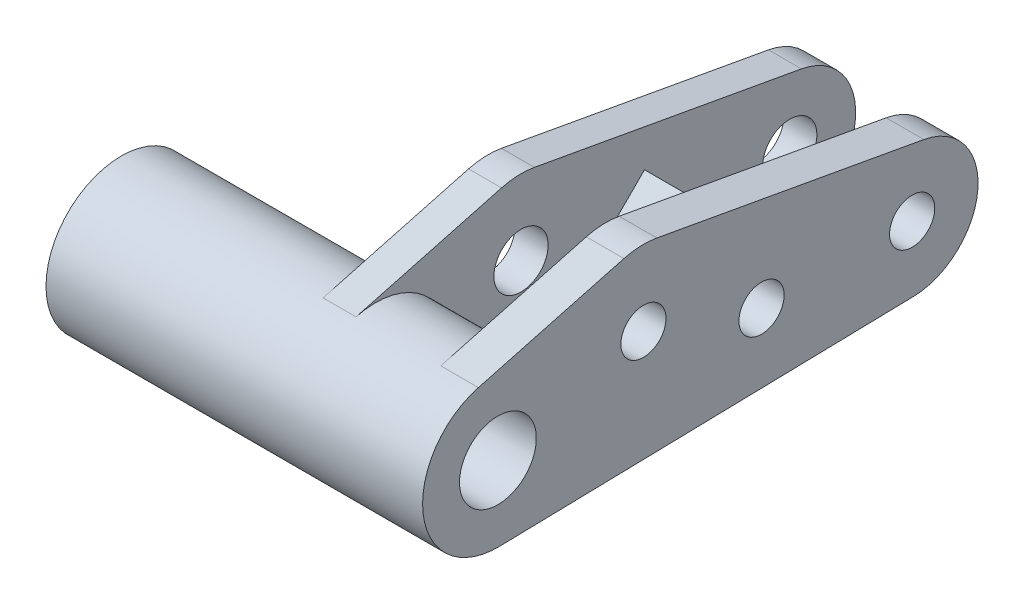
ISO-10303-21;
HEADER;
FILE_DESCRIPTION(('STEP AP214'),'2;1');
FILE_NAME('part.step','',(''),(''),'','','');
FILE_SCHEMA(('AUTOMOTIVE_DESIGN { 1 0 10303 214 1 1 1 1 }'));
ENDSEC;
DATA;
#1=APPLICATION_CONTEXT('core data for automotive mechanical design processes');
#2=APPLICATION_PROTOCOL_DEFINITION('international standard','automotive_design',2000,#1);
#3=PRODUCT_CONTEXT('',#1,'mechanical');
#4=PRODUCT('Part','Part','',(#3));
#5=PRODUCT_RELATED_PRODUCT_CATEGORY('part','',(#4));
#6=PRODUCT_DEFINITION_FORMATION('','',#4);
#7=PRODUCT_DEFINITION_CONTEXT('part definition',#1,'design');
#8=PRODUCT_DEFINITION('design','',#6,#7);
#9=PRODUCT_DEFINITION_SHAPE('','',#8);
#10=(LENGTH_UNIT() NAMED_UNIT(*) SI_UNIT(.MILLI.,.METRE.));
#11=(NAMED_UNIT(*) PLANE_ANGLE_UNIT() SI_UNIT($,.RADIAN.));
#12=(NAMED_UNIT(*) SI_UNIT($,.STERADIAN.) SOLID_ANGLE_UNIT());
#13=UNCERTAINTY_MEASURE_WITH_UNIT(LENGTH_MEASURE(1.E-05),#10,'distance_accuracy_value','');
#14=(GEOMETRIC_REPRESENTATION_CONTEXT(3) GLOBAL_UNCERTAINTY_ASSIGNED_CONTEXT((#13)) GLOBAL_UNIT_ASSIGNED_CONTEXT((#10,
#11,#12)) REPRESENTATION_CONTEXT('',''));
#15=CARTESIAN_POINT('',(0.,0.,0.));
#16=DIRECTION('',(0.,0.,1.));
#17=DIRECTION('',(1.,0.,0.));
#18=AXIS2_PLACEMENT_3D('',#15,#16,#17);
#19=CARTESIAN_POINT('',(-13.096875,-6.34835980883225,-0.144318181818181));
#20=DIRECTION('',(0.,-0.999741702178308,-0.0227272727272727));
#21=DIRECTION('',(0.,-0.0227272727272727,0.999741702178308));
#22=AXIS2_PLACEMENT_3D('',#19,#20,#21);
#23=PLANE('',#22);
#24=DIRECTION('',(1.,0.,0.));
#25=VECTOR('',#24,1.);
#26=CARTESIAN_POINT('',(-10.31875,-5.62468257207032,-31.9778919321734));
#27=LINE('',#26,#25);
#28=CARTESIAN_POINT('',(-10.31875,-5.62468257207032,-31.9778919321734));
#29=VERTEX_POINT('',#28);
#30=CARTESIAN_POINT('',(-3.175,-5.62468257207032,-31.9778919321734));
#31=VERTEX_POINT('',#30);
#32=EDGE_CURVE('E220',#29,#31,#27,.T.);
#33=ORIENTED_EDGE('',*,*,#32,.T.);
#34=DIRECTION('',(0.,-0.022727272727273,0.999741702178308));
#35=VECTOR('',#34,1.);
#36=CARTESIAN_POINT('',(-3.175,-5.55481483272822,-35.0512784090909));
#37=LINE('',#36,#35);
#38=CARTESIAN_POINT('',(-3.175,-5.55481483272822,-35.0512784090909));
#39=VERTEX_POINT('',#38);
#40=EDGE_CURVE('E194',#39,#31,#37,.T.);
#41=ORIENTED_EDGE('',*,*,#40,.F.);
#42=DIRECTION('',(1.,0.,0.));
#43=VECTOR('',#42,1.);
#44=CARTESIAN_POINT('',(-13.096875,-5.55481483272822,-35.0512784090909));
#45=LINE('',#44,#43);
#46=CARTESIAN_POINT('',(0.,-5.55481483272822,-35.0512784090909));
#47=VERTEX_POINT('',#46);
#48=EDGE_CURVE('E130',#39,#47,#45,.T.);
#49=ORIENTED_EDGE('',*,*,#48,.T.);
#50=DIRECTION('',(0.,-0.0227272727272727,0.999741702178308));
#51=VECTOR('',#50,1.);
#52=CARTESIAN_POINT('',(0.,-6.34835980883225,-0.144318181818181));
#53=LINE('',#52,#51);
#54=CARTESIAN_POINT('',(0.,-6.34835980883225,-0.144318181818181));
#55=VERTEX_POINT('',#54);
#56=EDGE_CURVE('E153',#47,#55,#53,.T.);
#57=ORIENTED_EDGE('',*,*,#56,.T.);
#58=DIRECTION('',(1.,0.,0.));
#59=VECTOR('',#58,1.);
#60=CARTESIAN_POINT('',(-13.096875,-6.34835980883225,-0.144318181818181));
#61=LINE('',#60,#59);
#62=CARTESIAN_POINT('',(-13.096875,-6.34835980883225,-0.144318181818181));
#63=VERTEX_POINT('',#62);
#64=EDGE_CURVE('E50',#63,#55,#61,.T.);
#65=ORIENTED_EDGE('',*,*,#64,.F.);
#66=DIRECTION('',(0.,-0.0227272727272727,0.999741702178308));
#67=VECTOR('',#66,1.);
#68=CARTESIAN_POINT('',(-13.096875,-6.34835980883225,-0.144318181818181));
#69=LINE('',#68,#67);
#70=CARTESIAN_POINT('',(-13.096875,-5.55481483272822,-35.0512784090909));
#71=VERTEX_POINT('',#70);
#72=EDGE_CURVE('E137',#71,#63,#69,.T.);
#73=ORIENTED_EDGE('',*,*,#72,.F.);
#74=CARTESIAN_POINT('',(-10.31875,-5.55481483272822,-35.0512784090909));
#75=VERTEX_POINT('',#74);
#76=EDGE_CURVE('E135',#71,#75,#45,.T.);
#77=ORIENTED_EDGE('',*,*,#76,.T.);
#78=DIRECTION('',(0.,-0.022727272727273,0.999741702178308));
#79=VECTOR('',#78,1.);
#80=CARTESIAN_POINT('',(-10.31875,-5.55481483272822,-35.0512784090909));
#81=LINE('',#80,#79);
#82=EDGE_CURVE('E246',#75,#29,#81,.T.);
#83=ORIENTED_EDGE('',*,*,#82,.T.);
#84=EDGE_LOOP('',(#33,#41,#49,#57,#65,#73,#77,#83));
#85=FACE_BOUND('',#84,.T.);
#86=ADVANCED_FACE('F41',(#85),#23,.T.);
#87=CARTESIAN_POINT('',(-13.096875,0.,-34.925));
#88=DIRECTION('',(1.,0.,0.));
#89=DIRECTION('',(0.,0.,1.));
#90=AXIS2_PLACEMENT_3D('',#87,#88,#89);
#91=CYLINDRICAL_SURFACE('',#90,5.55625);
#92=ORIENTED_EDGE('',*,*,#76,.F.);
#93=CARTESIAN_POINT('',(-13.096875,0.,-34.925));
#94=DIRECTION('',(-1.,0.,0.));
#95=DIRECTION('',(0.,0.,-1.));
#96=AXIS2_PLACEMENT_3D('',#93,#94,#95);
#97=CIRCLE('',#96,5.55625);
#98=CARTESIAN_POINT('',(-13.096875,5.46772752838044,-35.9128611936354));
#99=VERTEX_POINT('',#98);
#100=EDGE_CURVE('E112',#99,#71,#97,.T.);
#101=ORIENTED_EDGE('',*,*,#100,.F.);
#102=DIRECTION('',(1.,0.,0.));
#103=VECTOR('',#102,1.);
#104=CARTESIAN_POINT('',(-13.096875,5.46772752838044,-35.9128611936354));
#105=LINE('',#104,#103);
#106=CARTESIAN_POINT('',(-10.31875,5.46772752838044,-35.9128611936354));
#107=VERTEX_POINT('',#106);
#108=EDGE_CURVE('E122',#99,#107,#105,.T.);
#109=ORIENTED_EDGE('',*,*,#108,.T.);
#110=CARTESIAN_POINT('',(-10.31875,0.,-34.925));
#111=DIRECTION('',(-1.,0.,0.));
#112=DIRECTION('',(0.,0.,1.));
#113=AXIS2_PLACEMENT_3D('',#110,#111,#112);
#114=CIRCLE('',#113,5.55625);
#115=EDGE_CURVE('E248',#107,#75,#114,.T.);
#116=ORIENTED_EDGE('',*,*,#115,.T.);
#117=EDGE_LOOP('',(#92,#101,#109,#116));
#118=FACE_BOUND('',#117,.T.);
#119=ADVANCED_FACE('F133',(#118),#91,.T.);
#120=CARTESIAN_POINT('',(-13.096875,5.46772752838044,-35.9128611936354));
#121=DIRECTION('',(0.,0.984067946615152,-0.177792790755526));
#122=DIRECTION('',(0.,-0.177792790755526,-0.984067946615152));
#123=AXIS2_PLACEMENT_3D('',#120,#121,#122);
#124=PLANE('',#123);
#125=ORIENTED_EDGE('',*,*,#108,.F.);
#126=DIRECTION('',(0.,-0.177792790755526,-0.984067946615152));
#127=VECTOR('',#126,1.);
#128=CARTESIAN_POINT('',(-13.096875,5.46772752838044,-35.9128611936354));
#129=LINE('',#128,#127);
#130=CARTESIAN_POINT('',(-13.096875,9.53583333380815,-13.3962422151688));
#131=VERTEX_POINT('',#130);
#132=EDGE_CURVE('E108',#131,#99,#129,.T.);
#133=ORIENTED_EDGE('',*,*,#132,.F.);
#134=DIRECTION('',(1.,0.,0.));
#135=VECTOR('',#134,1.);
#136=CARTESIAN_POINT('',(-13.096875,9.53583333380815,-13.3962422151688));
#137=LINE('',#136,#135);
#138=CARTESIAN_POINT('',(-10.31875,9.53583333380815,-13.3962422151688));
#139=VERTEX_POINT('',#138);
#140=EDGE_CURVE('E158',#131,#139,#137,.T.);
#141=ORIENTED_EDGE('',*,*,#140,.T.);
#142=DIRECTION('',(0.,-0.177792790755526,-0.984067946615152));
#143=VECTOR('',#142,1.);
#144=CARTESIAN_POINT('',(-10.31875,9.53583333380815,-13.3962422151688));
#145=LINE('',#144,#143);
#146=EDGE_CURVE('E126',#139,#107,#145,.T.);
#147=ORIENTED_EDGE('',*,*,#146,.T.);
#148=EDGE_LOOP('',(#125,#133,#141,#147));
#149=FACE_BOUND('',#148,.T.);
#150=ADVANCED_FACE('F123',(#149),#124,.T.);
#151=CARTESIAN_POINT('',(-13.096875,3.28700187280193,-12.2672579938712));
#152=DIRECTION('',(1.,0.,0.));
#153=DIRECTION('',(0.,0.,1.));
#154=AXIS2_PLACEMENT_3D('',#151,#152,#153);
#155=CYLINDRICAL_SURFACE('',#154,6.35);
#156=ORIENTED_EDGE('',*,*,#140,.F.);
#157=CARTESIAN_POINT('',(-13.096875,3.28700187280193,-12.2672579938712));
#158=DIRECTION('',(-1.,0.,0.));
#159=DIRECTION('',(0.,0.,-1.));
#160=AXIS2_PLACEMENT_3D('',#157,#158,#159);
#161=CIRCLE('',#160,6.35);
#162=CARTESIAN_POINT('',(-13.096875,9.42063086973753,-10.6237570574702));
#163=VERTEX_POINT('',#162);
#164=EDGE_CURVE('E115',#163,#131,#161,.T.);
#165=ORIENTED_EDGE('',*,*,#164,.F.);
#166=DIRECTION('',(1.,0.,0.));
#167=VECTOR('',#166,1.);
#168=CARTESIAN_POINT('',(-13.096875,9.42063086973753,-10.6237570574702));
#169=LINE('',#168,#167);
#170=CARTESIAN_POINT('',(-10.31875,9.42063086973753,-10.6237570574702));
#171=VERTEX_POINT('',#170);
#172=EDGE_CURVE('E161',#163,#171,#169,.T.);
#173=ORIENTED_EDGE('',*,*,#172,.T.);
#174=CARTESIAN_POINT('',(-10.31875,3.28700187280193,-12.2672579938712));
#175=DIRECTION('',(-1.,0.,0.));
#176=DIRECTION('',(0.,0.,1.));
#177=AXIS2_PLACEMENT_3D('',#174,#175,#176);
#178=CIRCLE('',#177,6.35);
#179=EDGE_CURVE('E251',#171,#139,#178,.T.);
#180=ORIENTED_EDGE('',*,*,#179,.T.);
#181=EDGE_LOOP('',(#156,#165,#173,#180));
#182=FACE_BOUND('',#181,.T.);
#183=ADVANCED_FACE('F357',(#182),#155,.T.);
#184=CARTESIAN_POINT('',(-13.096875,9.42063086973753,-10.6237570574702));
#185=DIRECTION('',(0.,0.96592582628907,0.258819045102514));
#186=DIRECTION('',(0.,0.258819045102514,-0.96592582628907));
#187=AXIS2_PLACEMENT_3D('',#184,#185,#186);
#188=PLANE('',#187);
#189=ORIENTED_EDGE('',*,*,#172,.F.);
#190=DIRECTION('',(0.,0.258819045102514,-0.96592582628907));
#191=VECTOR('',#190,1.);
#192=CARTESIAN_POINT('',(-13.096875,9.42063086973753,-10.6237570574702));
#193=LINE('',#192,#191);
#194=CARTESIAN_POINT('',(-13.096875,6.13362899693559,1.64350093640097));
#195=VERTEX_POINT('',#194);
#196=EDGE_CURVE('E100',#195,#163,#193,.T.);
#197=ORIENTED_EDGE('',*,*,#196,.F.);
#198=DIRECTION('',(1.,0.,0.));
#199=VECTOR('',#198,1.);
#200=CARTESIAN_POINT('',(-13.096875,6.1336289969356,1.64350093640097));
#201=LINE('',#200,#199);
#202=CARTESIAN_POINT('',(-10.31875,6.1336289969356,1.64350093640097));
#203=VERTEX_POINT('',#202);
#204=EDGE_CURVE('E165',#195,#203,#201,.T.);
#205=ORIENTED_EDGE('',*,*,#204,.T.);
#206=DIRECTION('',(0.,0.258819045102514,-0.96592582628907));
#207=VECTOR('',#206,1.);
#208=CARTESIAN_POINT('',(-10.31875,6.1336289969356,1.64350093640097));
#209=LINE('',#208,#207);
#210=EDGE_CURVE('E254',#203,#171,#209,.T.);
#211=ORIENTED_EDGE('',*,*,#210,.T.);
#212=EDGE_LOOP('',(#189,#197,#205,#211));
#213=FACE_BOUND('',#212,.T.);
#214=ADVANCED_FACE('F355',(#213),#188,.T.);
#215=CARTESIAN_POINT('',(-13.096875,0.,0.));
#216=DIRECTION('',(1.,0.,0.));
#217=DIRECTION('',(0.,0.,1.));
#218=AXIS2_PLACEMENT_3D('',#215,#216,#217);
#219=CYLINDRICAL_SURFACE('',#218,6.35);
#220=CARTESIAN_POINT('',(0.,0.,0.));
#221=DIRECTION('',(-1.,0.,0.));
#222=DIRECTION('',(0.,0.,1.));
#223=AXIS2_PLACEMENT_3D('',#220,#221,#222);
#224=CIRCLE('',#223,6.35);
#225=CARTESIAN_POINT('',(0.,6.1336289969356,1.64350093640097));
#226=VERTEX_POINT('',#225);
#227=EDGE_CURVE('E93',#55,#226,#224,.T.);
#228=ORIENTED_EDGE('',*,*,#227,.T.);
#229=CARTESIAN_POINT('',(-3.175,6.1336289969356,1.64350093640097));
#230=VERTEX_POINT('',#229);
#231=EDGE_CURVE('E139',#230,#226,#201,.T.);
#232=ORIENTED_EDGE('',*,*,#231,.F.);
#233=CARTESIAN_POINT('',(-3.175,0.,0.));
#234=DIRECTION('',(1.,0.,0.));
#235=DIRECTION('',(0.,0.,1.));
#236=AXIS2_PLACEMENT_3D('',#233,#234,#235);
#237=CIRCLE('',#236,6.35);
#238=CARTESIAN_POINT('',(-3.175,1.64350093640097,-6.13362899693559));
#239=VERTEX_POINT('',#238);
#240=EDGE_CURVE('E173',#239,#230,#237,.T.);
#241=ORIENTED_EDGE('',*,*,#240,.F.);
#242=DIRECTION('',(1.,0.,0.));
#243=VECTOR('',#242,1.);
#244=CARTESIAN_POINT('',(-10.31875,1.64350093640097,-6.13362899693559));
#245=LINE('',#244,#243);
#246=CARTESIAN_POINT('',(-10.31875,1.64350093640097,-6.13362899693559));
#247=VERTEX_POINT('',#246);
#248=EDGE_CURVE('E145',#247,#239,#245,.T.);
#249=ORIENTED_EDGE('',*,*,#248,.F.);
#250=CARTESIAN_POINT('',(-10.31875,0.,0.));
#251=DIRECTION('',(1.,0.,0.));
#252=DIRECTION('',(0.,0.,1.));
#253=AXIS2_PLACEMENT_3D('',#250,#251,#252);
#254=CIRCLE('',#253,6.35);
#255=EDGE_CURVE('E208',#247,#203,#254,.T.);
#256=ORIENTED_EDGE('',*,*,#255,.T.);
#257=ORIENTED_EDGE('',*,*,#204,.F.);
#258=CARTESIAN_POINT('',(-13.096875,0.,0.));
#259=DIRECTION('',(1.,0.,0.));
#260=DIRECTION('',(0.,0.,-1.));
#261=AXIS2_PLACEMENT_3D('',#258,#259,#260);
#262=CIRCLE('',#261,6.35);
#263=EDGE_CURVE('E11',#63,#195,#262,.T.);
#264=ORIENTED_EDGE('',*,*,#263,.F.);
#265=ORIENTED_EDGE('',*,*,#64,.T.);
#266=EDGE_LOOP('',(#228,#232,#241,#249,#256,#257,#264,#265));
#267=FACE_BOUND('',#266,.T.);
#268=CARTESIAN_POINT('',(-31.75,0.,0.));
#269=DIRECTION('',(-1.,0.,0.));
#270=DIRECTION('',(0.,0.,1.));
#271=AXIS2_PLACEMENT_3D('',#268,#269,#270);
#272=CIRCLE('',#271,6.35);
#273=CARTESIAN_POINT('',(-31.75,0.,6.35));
#274=VERTEX_POINT('',#273);
#275=EDGE_CURVE('E273',#274,#274,#272,.T.);
#276=ORIENTED_EDGE('',*,*,#275,.F.);
#277=EDGE_LOOP('',(#276));
#278=FACE_BOUND('',#277,.T.);
#279=ADVANCED_FACE('F43',(#267,#278),#219,.T.);
#280=CARTESIAN_POINT('',(-3.175,0.,-34.925));
#281=DIRECTION('',(-1.,0.,0.));
#282=DIRECTION('',(0.,0.,1.));
#283=AXIS2_PLACEMENT_3D('',#280,#281,#282);
#284=CIRCLE('',#283,5.55625);
#285=CARTESIAN_POINT('',(-3.175,5.46772752838044,-35.9128611936354));
#286=VERTEX_POINT('',#285);
#287=EDGE_CURVE('E191',#286,#39,#284,.T.);
#288=ORIENTED_EDGE('',*,*,#287,.F.);
#289=CARTESIAN_POINT('',(0.,5.46772752838044,-35.9128611936354));
#290=VERTEX_POINT('',#289);
#291=EDGE_CURVE('E131',#286,#290,#105,.T.);
#292=ORIENTED_EDGE('',*,*,#291,.T.);
#293=CARTESIAN_POINT('',(0.,0.,-34.925));
#294=DIRECTION('',(-1.,0.,0.));
#295=DIRECTION('',(0.,0.,-1.));
#296=AXIS2_PLACEMENT_3D('',#293,#294,#295);
#297=CIRCLE('',#296,5.55625);
#298=EDGE_CURVE('E151',#290,#47,#297,.T.);
#299=ORIENTED_EDGE('',*,*,#298,.T.);
#300=ORIENTED_EDGE('',*,*,#48,.F.);
#301=EDGE_LOOP('',(#288,#292,#299,#300));
#302=FACE_BOUND('',#301,.T.);
#303=ADVANCED_FACE('F381',(#302),#91,.T.);
#304=DIRECTION('',(0.,-0.177792790755526,-0.984067946615152));
#305=VECTOR('',#304,1.);
#306=CARTESIAN_POINT('',(-3.175,9.53583333380815,-13.3962422151688));
#307=LINE('',#306,#305);
#308=CARTESIAN_POINT('',(-3.175,9.53583333380815,-13.3962422151688));
#309=VERTEX_POINT('',#308);
#310=EDGE_CURVE('E188',#309,#286,#307,.T.);
#311=ORIENTED_EDGE('',*,*,#310,.F.);
#312=CARTESIAN_POINT('',(0.,9.53583333380815,-13.3962422151688));
#313=VERTEX_POINT('',#312);
#314=EDGE_CURVE('E160',#309,#313,#137,.T.);
#315=ORIENTED_EDGE('',*,*,#314,.T.);
#316=DIRECTION('',(0.,-0.177792790755526,-0.984067946615152));
#317=VECTOR('',#316,1.);
#318=CARTESIAN_POINT('',(0.,5.46772752838044,-35.9128611936354));
#319=LINE('',#318,#317);
#320=EDGE_CURVE('E149',#313,#290,#319,.T.);
#321=ORIENTED_EDGE('',*,*,#320,.T.);
#322=ORIENTED_EDGE('',*,*,#291,.F.);
#323=EDGE_LOOP('',(#311,#315,#321,#322));
#324=FACE_BOUND('',#323,.T.);
#325=ADVANCED_FACE('F377',(#324),#124,.T.);
#326=CARTESIAN_POINT('',(-3.175,3.28700187280193,-12.2672579938712));
#327=DIRECTION('',(-1.,0.,0.));
#328=DIRECTION('',(0.,0.,1.));
#329=AXIS2_PLACEMENT_3D('',#326,#327,#328);
#330=CIRCLE('',#329,6.35);
#331=CARTESIAN_POINT('',(-3.175,9.42063086973753,-10.6237570574702));
#332=VERTEX_POINT('',#331);
#333=EDGE_CURVE('E181',#332,#309,#330,.T.);
#334=ORIENTED_EDGE('',*,*,#333,.F.);
#335=CARTESIAN_POINT('',(0.,9.42063086973753,-10.6237570574702));
#336=VERTEX_POINT('',#335);
#337=EDGE_CURVE('E164',#332,#336,#169,.T.);
#338=ORIENTED_EDGE('',*,*,#337,.T.);
#339=CARTESIAN_POINT('',(0.,3.28700187280193,-12.2672579938712));
#340=DIRECTION('',(-1.,0.,0.));
#341=DIRECTION('',(0.,0.,-1.));
#342=AXIS2_PLACEMENT_3D('',#339,#340,#341);
#343=CIRCLE('',#342,6.35);
#344=EDGE_CURVE('E147',#336,#313,#343,.T.);
#345=ORIENTED_EDGE('',*,*,#344,.T.);
#346=ORIENTED_EDGE('',*,*,#314,.F.);
#347=EDGE_LOOP('',(#334,#338,#345,#346));
#348=FACE_BOUND('',#347,.T.);
#349=ADVANCED_FACE('F369',(#348),#155,.T.);
#350=DIRECTION('',(0.,0.258819045102514,-0.96592582628907));
#351=VECTOR('',#350,1.);
#352=CARTESIAN_POINT('',(-3.175,6.1336289969356,1.64350093640097));
#353=LINE('',#352,#351);
#354=EDGE_CURVE('E58',#230,#332,#353,.T.);
#355=ORIENTED_EDGE('',*,*,#354,.F.);
#356=ORIENTED_EDGE('',*,*,#231,.T.);
#357=DIRECTION('',(0.,0.258819045102514,-0.96592582628907));
#358=VECTOR('',#357,1.);
#359=CARTESIAN_POINT('',(0.,9.42063086973753,-10.6237570574702));
#360=LINE('',#359,#358);
#361=EDGE_CURVE('E144',#226,#336,#360,.T.);
#362=ORIENTED_EDGE('',*,*,#361,.T.);
#363=ORIENTED_EDGE('',*,*,#337,.F.);
#364=EDGE_LOOP('',(#355,#356,#362,#363));
#365=FACE_BOUND('',#364,.T.);
#366=ADVANCED_FACE('F363',(#365),#188,.T.);
#367=CARTESIAN_POINT('',(-13.096875,0.,0.));
#368=DIRECTION('',(1.,0.,0.));
#369=DIRECTION('',(0.,0.,1.));
#370=AXIS2_PLACEMENT_3D('',#367,#368,#369);
#371=PLANE('',#370);
#372=CARTESIAN_POINT('',(-13.096875,3.28700187280193,-12.2672579938712));
#373=DIRECTION('',(1.,0.,0.));
#374=DIRECTION('',(0.,0.,-1.));
#375=AXIS2_PLACEMENT_3D('',#372,#373,#374);
#376=CIRCLE('',#375,2.286);
#377=CARTESIAN_POINT('',(-13.096875,3.28700187280193,-14.5532579938712));
#378=VERTEX_POINT('',#377);
#379=EDGE_CURVE('E286',#378,#378,#376,.T.);
#380=ORIENTED_EDGE('',*,*,#379,.T.);
#381=EDGE_LOOP('',(#380));
#382=FACE_BOUND('',#381,.T.);
#383=CARTESIAN_POINT('',(-13.096875,0.,-22.225));
#384=DIRECTION('',(1.,0.,0.));
#385=DIRECTION('',(0.,0.,-1.));
#386=AXIS2_PLACEMENT_3D('',#383,#384,#385);
#387=CIRCLE('',#386,2.286);
#388=CARTESIAN_POINT('',(-13.096875,0.,-24.511));
#389=VERTEX_POINT('',#388);
#390=EDGE_CURVE('E283',#389,#389,#387,.T.);
#391=ORIENTED_EDGE('',*,*,#390,.T.);
#392=EDGE_LOOP('',(#391));
#393=FACE_BOUND('',#392,.T.);
#394=CARTESIAN_POINT('',(-13.096875,0.,-34.925));
#395=DIRECTION('',(1.,0.,0.));
#396=DIRECTION('',(0.,0.,-1.));
#397=AXIS2_PLACEMENT_3D('',#394,#395,#396);
#398=CIRCLE('',#397,2.28599999999999);
#399=CARTESIAN_POINT('',(-13.096875,0.,-37.211));
#400=VERTEX_POINT('',#399);
#401=EDGE_CURVE('E276',#400,#400,#398,.T.);
#402=ORIENTED_EDGE('',*,*,#401,.T.);
#403=EDGE_LOOP('',(#402));
#404=FACE_BOUND('',#403,.T.);
#405=ORIENTED_EDGE('',*,*,#263,.T.);
#406=ORIENTED_EDGE('',*,*,#196,.T.);
#407=ORIENTED_EDGE('',*,*,#164,.T.);
#408=ORIENTED_EDGE('',*,*,#132,.T.);
#409=ORIENTED_EDGE('',*,*,#100,.T.);
#410=ORIENTED_EDGE('',*,*,#72,.T.);
#411=EDGE_LOOP('',(#405,#406,#407,#408,#409,#410));
#412=FACE_BOUND('',#411,.T.);
#413=ADVANCED_FACE('F110',(#382,#393,#404,#412),#371,.F.);
#414=CARTESIAN_POINT('',(0.,0.,0.));
#415=DIRECTION('',(1.,0.,0.));
#416=DIRECTION('',(0.,0.,1.));
#417=AXIS2_PLACEMENT_3D('',#414,#415,#416);
#418=PLANE('',#417);
#419=CARTESIAN_POINT('',(0.,0.,0.));
#420=DIRECTION('',(-1.,0.,0.));
#421=DIRECTION('',(0.,0.,1.));
#422=AXIS2_PLACEMENT_3D('',#419,#420,#421);
#423=CIRCLE('',#422,3.2385);
#424=CARTESIAN_POINT('',(0.,0.,3.2385));
#425=VERTEX_POINT('',#424);
#426=EDGE_CURVE('E171',#425,#425,#423,.T.);
#427=ORIENTED_EDGE('',*,*,#426,.T.);
#428=EDGE_LOOP('',(#427));
#429=FACE_BOUND('',#428,.T.);
#430=CARTESIAN_POINT('',(0.,0.,-22.225));
#431=DIRECTION('',(-1.,0.,0.));
#432=DIRECTION('',(0.,0.,1.));
#433=AXIS2_PLACEMENT_3D('',#430,#431,#432);
#434=CIRCLE('',#433,1.905);
#435=CARTESIAN_POINT('',(0.,0.,-20.32));
#436=VERTEX_POINT('',#435);
#437=EDGE_CURVE('E263',#436,#436,#434,.T.);
#438=ORIENTED_EDGE('',*,*,#437,.T.);
#439=EDGE_LOOP('',(#438));
#440=FACE_BOUND('',#439,.T.);
#441=CARTESIAN_POINT('',(0.,3.28700187280193,-12.2672579938712));
#442=DIRECTION('',(-1.,0.,0.));
#443=DIRECTION('',(0.,0.,1.));
#444=AXIS2_PLACEMENT_3D('',#441,#442,#443);
#445=CIRCLE('',#444,1.905);
#446=CARTESIAN_POINT('',(0.,3.28700187280193,-10.3622579938712));
#447=VERTEX_POINT('',#446);
#448=EDGE_CURVE('E259',#447,#447,#445,.T.);
#449=ORIENTED_EDGE('',*,*,#448,.T.);
#450=EDGE_LOOP('',(#449));
#451=FACE_BOUND('',#450,.T.);
#452=CARTESIAN_POINT('',(0.,0.,-34.925));
#453=DIRECTION('',(-1.,0.,0.));
#454=DIRECTION('',(0.,0.,1.));
#455=AXIS2_PLACEMENT_3D('',#452,#453,#454);
#456=CIRCLE('',#455,1.905);
#457=CARTESIAN_POINT('',(0.,0.,-33.02));
#458=VERTEX_POINT('',#457);
#459=EDGE_CURVE('E262',#458,#458,#456,.T.);
#460=ORIENTED_EDGE('',*,*,#459,.T.);
#461=EDGE_LOOP('',(#460));
#462=FACE_BOUND('',#461,.T.);
#463=ORIENTED_EDGE('',*,*,#227,.F.);
#464=ORIENTED_EDGE('',*,*,#56,.F.);
#465=ORIENTED_EDGE('',*,*,#298,.F.);
#466=ORIENTED_EDGE('',*,*,#320,.F.);
#467=ORIENTED_EDGE('',*,*,#344,.F.);
#468=ORIENTED_EDGE('',*,*,#361,.F.);
#469=EDGE_LOOP('',(#463,#464,#465,#466,#467,#468));
#470=FACE_BOUND('',#469,.T.);
#471=ADVANCED_FACE('F395',(#429,#440,#451,#462,#470),#418,.T.);
#472=CARTESIAN_POINT('',(-10.31875,3.28700187280193,-12.2672579938712));
#473=DIRECTION('',(1.,0.,0.));
#474=DIRECTION('',(0.,0.,1.));
#475=AXIS2_PLACEMENT_3D('',#472,#473,#474);
#476=CYLINDRICAL_SURFACE('',#475,6.35);
#477=CARTESIAN_POINT('',(-3.175,3.28700187280193,-12.2672579938712));
#478=DIRECTION('',(-1.,0.,0.));
#479=DIRECTION('',(0.,0.,-1.));
#480=AXIS2_PLACEMENT_3D('',#477,#478,#479);
#481=CIRCLE('',#480,6.35);
#482=CARTESIAN_POINT('',(-3.175,-1.20312618773267,-16.7573860544057));
#483=VERTEX_POINT('',#482);
#484=EDGE_CURVE('E206',#483,#239,#481,.T.);
#485=ORIENTED_EDGE('',*,*,#484,.F.);
#486=DIRECTION('',(1.,0.,0.));
#487=VECTOR('',#486,1.);
#488=CARTESIAN_POINT('',(-10.31875,-1.20312618773267,-16.7573860544057));
#489=LINE('',#488,#487);
#490=CARTESIAN_POINT('',(-10.31875,-1.20312618773267,-16.7573860544057));
#491=VERTEX_POINT('',#490);
#492=EDGE_CURVE('E211',#491,#483,#489,.T.);
#493=ORIENTED_EDGE('',*,*,#492,.F.);
#494=CARTESIAN_POINT('',(-10.31875,3.28700187280193,-12.2672579938712));
#495=DIRECTION('',(-1.,0.,0.));
#496=DIRECTION('',(0.,0.,-1.));
#497=AXIS2_PLACEMENT_3D('',#494,#495,#496);
#498=CIRCLE('',#497,6.35);
#499=EDGE_CURVE('E184',#491,#247,#498,.T.);
#500=ORIENTED_EDGE('',*,*,#499,.T.);
#501=ORIENTED_EDGE('',*,*,#248,.T.);
#502=EDGE_LOOP('',(#485,#493,#500,#501));
#503=FACE_BOUND('',#502,.T.);
#504=ADVANCED_FACE('F319',(#503),#476,.F.);
#505=CARTESIAN_POINT('',(-10.31875,-1.20312618773267,-16.7573860544057));
#506=DIRECTION('',(0.,-0.707106781186551,-0.707106781186544));
#507=DIRECTION('',(0.,-0.707106781186544,0.707106781186551));
#508=AXIS2_PLACEMENT_3D('',#505,#506,#507);
#509=PLANE('',#508);
#510=DIRECTION('',(0.,-0.707106781186544,0.707106781186551));
#511=VECTOR('',#510,1.);
#512=CARTESIAN_POINT('',(-3.175,-1.20312618773267,-16.7573860544057));
#513=LINE('',#512,#511);
#514=CARTESIAN_POINT('',(-3.175,4.71706443932468,-22.6775766814632));
#515=VERTEX_POINT('',#514);
#516=EDGE_CURVE('E203',#515,#483,#513,.T.);
#517=ORIENTED_EDGE('',*,*,#516,.F.);
#518=DIRECTION('',(1.,0.,0.));
#519=VECTOR('',#518,1.);
#520=CARTESIAN_POINT('',(-10.31875,4.71706443932468,-22.6775766814632));
#521=LINE('',#520,#519);
#522=CARTESIAN_POINT('',(-10.31875,4.71706443932468,-22.6775766814632));
#523=VERTEX_POINT('',#522);
#524=EDGE_CURVE('E214',#523,#515,#521,.T.);
#525=ORIENTED_EDGE('',*,*,#524,.F.);
#526=DIRECTION('',(0.,-0.707106781186544,0.707106781186551));
#527=VECTOR('',#526,1.);
#528=CARTESIAN_POINT('',(-10.31875,-1.20312618773267,-16.7573860544057));
#529=LINE('',#528,#527);
#530=EDGE_CURVE('E229',#523,#491,#529,.T.);
#531=ORIENTED_EDGE('',*,*,#530,.T.);
#532=ORIENTED_EDGE('',*,*,#492,.T.);
#533=EDGE_LOOP('',(#517,#525,#531,#532));
#534=FACE_BOUND('',#533,.T.);
#535=ADVANCED_FACE('F387',(#534),#509,.F.);
#536=CARTESIAN_POINT('',(-10.31875,4.71706443932468,-22.6775766814632));
#537=DIRECTION('',(0.,-0.642787609686544,0.766044443118974));
#538=DIRECTION('',(0.,0.766044443118974,0.642787609686544));
#539=AXIS2_PLACEMENT_3D('',#536,#537,#538);
#540=PLANE('',#539);
#541=DIRECTION('',(0.,0.766044443118974,0.642787609686544));
#542=VECTOR('',#541,1.);
#543=CARTESIAN_POINT('',(-3.175,4.71706443932468,-22.6775766814632));
#544=LINE('',#543,#542);
#545=CARTESIAN_POINT('',(-3.175,-4.08170132150955,-30.0606177861945));
#546=VERTEX_POINT('',#545);
#547=EDGE_CURVE('E200',#546,#515,#544,.T.);
#548=ORIENTED_EDGE('',*,*,#547,.F.);
#549=DIRECTION('',(1.,0.,0.));
#550=VECTOR('',#549,1.);
#551=CARTESIAN_POINT('',(-10.31875,-4.08170132150955,-30.0606177861945));
#552=LINE('',#551,#550);
#553=CARTESIAN_POINT('',(-10.31875,-4.08170132150955,-30.0606177861945));
#554=VERTEX_POINT('',#553);
#555=EDGE_CURVE('E217',#554,#546,#552,.T.);
#556=ORIENTED_EDGE('',*,*,#555,.F.);
#557=DIRECTION('',(0.,0.766044443118974,0.642787609686544));
#558=VECTOR('',#557,1.);
#559=CARTESIAN_POINT('',(-10.31875,4.71706443932468,-22.6775766814632));
#560=LINE('',#559,#558);
#561=EDGE_CURVE('E235',#554,#523,#560,.T.);
#562=ORIENTED_EDGE('',*,*,#561,.T.);
#563=ORIENTED_EDGE('',*,*,#524,.T.);
#564=EDGE_LOOP('',(#548,#556,#562,#563));
#565=FACE_BOUND('',#564,.T.);
#566=ADVANCED_FACE('F386',(#565),#540,.F.);
#567=CARTESIAN_POINT('',(-10.31875,0.,-34.925));
#568=DIRECTION('',(1.,0.,0.));
#569=DIRECTION('',(0.,0.,1.));
#570=AXIS2_PLACEMENT_3D('',#567,#568,#569);
#571=CYLINDRICAL_SURFACE('',#570,6.35);
#572=CARTESIAN_POINT('',(-3.175,0.,-34.925));
#573=DIRECTION('',(-1.,0.,0.));
#574=DIRECTION('',(0.,0.,-1.));
#575=AXIS2_PLACEMENT_3D('',#572,#573,#574);
#576=CIRCLE('',#575,6.35);
#577=EDGE_CURVE('E197',#31,#546,#576,.T.);
#578=ORIENTED_EDGE('',*,*,#577,.F.);
#579=ORIENTED_EDGE('',*,*,#32,.F.);
#580=CARTESIAN_POINT('',(-10.31875,0.,-34.925));
#581=DIRECTION('',(-1.,0.,0.));
#582=DIRECTION('',(0.,0.,-1.));
#583=AXIS2_PLACEMENT_3D('',#580,#581,#582);
#584=CIRCLE('',#583,6.35);
#585=EDGE_CURVE('E241',#29,#554,#584,.T.);
#586=ORIENTED_EDGE('',*,*,#585,.T.);
#587=ORIENTED_EDGE('',*,*,#555,.T.);
#588=EDGE_LOOP('',(#578,#579,#586,#587));
#589=FACE_BOUND('',#588,.T.);
#590=ADVANCED_FACE('F308',(#589),#571,.F.);
#591=CARTESIAN_POINT('',(-10.31875,0.,0.));
#592=DIRECTION('',(1.,0.,0.));
#593=DIRECTION('',(0.,0.,1.));
#594=AXIS2_PLACEMENT_3D('',#591,#592,#593);
#595=PLANE('',#594);
#596=CARTESIAN_POINT('',(-10.31875,3.28700187280193,-12.2672579938712));
#597=DIRECTION('',(-1.,0.,0.));
#598=DIRECTION('',(0.,0.,1.));
#599=AXIS2_PLACEMENT_3D('',#596,#597,#598);
#600=CIRCLE('',#599,2.286);
#601=CARTESIAN_POINT('',(-10.31875,3.28700187280193,-9.98125799387119));
#602=VERTEX_POINT('',#601);
#603=EDGE_CURVE('E289',#602,#602,#600,.F.);
#604=ORIENTED_EDGE('',*,*,#603,.F.);
#605=EDGE_LOOP('',(#604));
#606=FACE_BOUND('',#605,.T.);
#607=CARTESIAN_POINT('',(-10.31875,0.,-34.925));
#608=DIRECTION('',(-1.,0.,0.));
#609=DIRECTION('',(0.,0.,1.));
#610=AXIS2_PLACEMENT_3D('',#607,#608,#609);
#611=CIRCLE('',#610,2.28599999999999);
#612=CARTESIAN_POINT('',(-10.31875,0.,-32.639));
#613=VERTEX_POINT('',#612);
#614=EDGE_CURVE('E280',#613,#613,#611,.F.);
#615=ORIENTED_EDGE('',*,*,#614,.F.);
#616=EDGE_LOOP('',(#615));
#617=FACE_BOUND('',#616,.T.);
#618=ORIENTED_EDGE('',*,*,#255,.F.);
#619=ORIENTED_EDGE('',*,*,#499,.F.);
#620=ORIENTED_EDGE('',*,*,#530,.F.);
#621=ORIENTED_EDGE('',*,*,#561,.F.);
#622=ORIENTED_EDGE('',*,*,#585,.F.);
#623=ORIENTED_EDGE('',*,*,#82,.F.);
#624=ORIENTED_EDGE('',*,*,#115,.F.);
#625=ORIENTED_EDGE('',*,*,#146,.F.);
#626=ORIENTED_EDGE('',*,*,#179,.F.);
#627=ORIENTED_EDGE('',*,*,#210,.F.);
#628=EDGE_LOOP('',(#618,#619,#620,#621,#622,#623,#624,#625,#626,#627));
#629=FACE_BOUND('',#628,.T.);
#630=ADVANCED_FACE('F304',(#606,#617,#629),#595,.T.);
#631=CARTESIAN_POINT('',(-3.175,0.,0.));
#632=DIRECTION('',(1.,0.,0.));
#633=DIRECTION('',(0.,0.,1.));
#634=AXIS2_PLACEMENT_3D('',#631,#632,#633);
#635=PLANE('',#634);
#636=CARTESIAN_POINT('',(-3.175,3.28700187280193,-12.2672579938712));
#637=DIRECTION('',(-1.,0.,0.));
#638=DIRECTION('',(0.,0.,1.));
#639=AXIS2_PLACEMENT_3D('',#636,#637,#638);
#640=CIRCLE('',#639,1.905);
#641=CARTESIAN_POINT('',(-3.175,3.28700187280193,-10.3622579938712));
#642=VERTEX_POINT('',#641);
#643=EDGE_CURVE('E170',#642,#642,#640,.T.);
#644=ORIENTED_EDGE('',*,*,#643,.F.);
#645=EDGE_LOOP('',(#644));
#646=FACE_BOUND('',#645,.T.);
#647=CARTESIAN_POINT('',(-3.175,0.,-34.925));
#648=DIRECTION('',(-1.,0.,0.));
#649=DIRECTION('',(0.,0.,1.));
#650=AXIS2_PLACEMENT_3D('',#647,#648,#649);
#651=CIRCLE('',#650,1.905);
#652=CARTESIAN_POINT('',(-3.175,0.,-33.02));
#653=VERTEX_POINT('',#652);
#654=EDGE_CURVE('E168',#653,#653,#651,.T.);
#655=ORIENTED_EDGE('',*,*,#654,.F.);
#656=EDGE_LOOP('',(#655));
#657=FACE_BOUND('',#656,.T.);
#658=ORIENTED_EDGE('',*,*,#240,.T.);
#659=ORIENTED_EDGE('',*,*,#354,.T.);
#660=ORIENTED_EDGE('',*,*,#333,.T.);
#661=ORIENTED_EDGE('',*,*,#310,.T.);
#662=ORIENTED_EDGE('',*,*,#287,.T.);
#663=ORIENTED_EDGE('',*,*,#40,.T.);
#664=ORIENTED_EDGE('',*,*,#577,.T.);
#665=ORIENTED_EDGE('',*,*,#547,.T.);
#666=ORIENTED_EDGE('',*,*,#516,.T.);
#667=ORIENTED_EDGE('',*,*,#484,.T.);
#668=EDGE_LOOP('',(#658,#659,#660,#661,#662,#663,#664,#665,#666,#667));
#669=FACE_BOUND('',#668,.T.);
#670=ADVANCED_FACE('F307',(#646,#657,#669),#635,.F.);
#671=CARTESIAN_POINT('',(-13.096875,0.,-34.925));
#672=DIRECTION('',(1.,0.,0.));
#673=DIRECTION('',(0.,0.,1.));
#674=AXIS2_PLACEMENT_3D('',#671,#672,#673);
#675=CYLINDRICAL_SURFACE('',#674,1.905);
#676=ORIENTED_EDGE('',*,*,#459,.F.);
#677=EDGE_LOOP('',(#676));
#678=FACE_BOUND('',#677,.T.);
#679=ORIENTED_EDGE('',*,*,#654,.T.);
#680=EDGE_LOOP('',(#679));
#681=FACE_BOUND('',#680,.T.);
#682=ADVANCED_FACE('F527',(#678,#681),#675,.F.);
#683=CARTESIAN_POINT('',(-13.096875,3.28700187280193,-12.2672579938712));
#684=DIRECTION('',(1.,0.,0.));
#685=DIRECTION('',(0.,0.,1.));
#686=AXIS2_PLACEMENT_3D('',#683,#684,#685);
#687=CYLINDRICAL_SURFACE('',#686,1.905);
#688=ORIENTED_EDGE('',*,*,#448,.F.);
#689=EDGE_LOOP('',(#688));
#690=FACE_BOUND('',#689,.T.);
#691=ORIENTED_EDGE('',*,*,#643,.T.);
#692=EDGE_LOOP('',(#691));
#693=FACE_BOUND('',#692,.T.);
#694=ADVANCED_FACE('F533',(#690,#693),#687,.F.);
#695=CARTESIAN_POINT('',(-13.096875,0.,-22.225));
#696=DIRECTION('',(1.,0.,0.));
#697=DIRECTION('',(0.,0.,1.));
#698=AXIS2_PLACEMENT_3D('',#695,#696,#697);
#699=CYLINDRICAL_SURFACE('',#698,1.905);
#700=CARTESIAN_POINT('',(-10.31875,0.,-22.225));
#701=DIRECTION('',(-1.,0.,0.));
#702=DIRECTION('',(0.,0.,1.));
#703=AXIS2_PLACEMENT_3D('',#700,#701,#702);
#704=CIRCLE('',#703,1.905);
#705=CARTESIAN_POINT('',(-10.31875,0.,-20.32));
#706=VERTEX_POINT('',#705);
#707=EDGE_CURVE('E45',#706,#706,#704,.F.);
#708=ORIENTED_EDGE('',*,*,#707,.F.);
#709=EDGE_LOOP('',(#708));
#710=FACE_BOUND('',#709,.T.);
#711=ORIENTED_EDGE('',*,*,#437,.F.);
#712=EDGE_LOOP('',(#711));
#713=FACE_BOUND('',#712,.T.);
#714=ADVANCED_FACE('F538',(#710,#713),#699,.F.);
#715=CARTESIAN_POINT('',(-13.096875,0.,0.));
#716=DIRECTION('',(1.,0.,0.));
#717=DIRECTION('',(0.,0.,1.));
#718=AXIS2_PLACEMENT_3D('',#715,#716,#717);
#719=CYLINDRICAL_SURFACE('',#718,3.2385);
#720=ORIENTED_EDGE('',*,*,#426,.F.);
#721=EDGE_LOOP('',(#720));
#722=FACE_BOUND('',#721,.T.);
#723=CARTESIAN_POINT('',(-31.75,0.,0.));
#724=DIRECTION('',(-1.,0.,0.));
#725=DIRECTION('',(0.,0.,1.));
#726=AXIS2_PLACEMENT_3D('',#723,#724,#725);
#727=CIRCLE('',#726,3.2385);
#728=CARTESIAN_POINT('',(-31.75,0.,3.2385));
#729=VERTEX_POINT('',#728);
#730=EDGE_CURVE('E268',#729,#729,#727,.T.);
#731=ORIENTED_EDGE('',*,*,#730,.T.);
#732=EDGE_LOOP('',(#731));
#733=FACE_BOUND('',#732,.T.);
#734=ADVANCED_FACE('F555',(#722,#733),#719,.F.);
#735=CARTESIAN_POINT('',(-31.75,-36.0732523739389,-8.34778193091498));
#736=DIRECTION('',(1.,0.,0.));
#737=DIRECTION('',(0.,0.,1.));
#738=AXIS2_PLACEMENT_3D('',#735,#736,#737);
#739=PLANE('',#738);
#740=ORIENTED_EDGE('',*,*,#730,.F.);
#741=EDGE_LOOP('',(#740));
#742=FACE_BOUND('',#741,.T.);
#743=ORIENTED_EDGE('',*,*,#275,.T.);
#744=EDGE_LOOP('',(#743));
#745=FACE_BOUND('',#744,.T.);
#746=ADVANCED_FACE('F564',(#742,#745),#739,.F.);
#747=CARTESIAN_POINT('',(-10.31875,0.,0.));
#748=DIRECTION('',(1.,0.,0.));
#749=DIRECTION('',(0.,0.,1.));
#750=AXIS2_PLACEMENT_3D('',#747,#748,#749);
#751=PLANE('',#750);
#752=CARTESIAN_POINT('',(-10.31875,0.,-22.225));
#753=DIRECTION('',(-1.,0.,0.));
#754=DIRECTION('',(0.,0.,1.));
#755=AXIS2_PLACEMENT_3D('',#752,#753,#754);
#756=CIRCLE('',#755,2.286);
#757=CARTESIAN_POINT('',(-10.31875,0.,-19.939));
#758=VERTEX_POINT('',#757);
#759=EDGE_CURVE('E279',#758,#758,#756,.F.);
#760=ORIENTED_EDGE('',*,*,#759,.F.);
#761=EDGE_LOOP('',(#760));
#762=FACE_BOUND('',#761,.T.);
#763=ORIENTED_EDGE('',*,*,#707,.T.);
#764=EDGE_LOOP('',(#763));
#765=FACE_BOUND('',#764,.T.);
#766=ADVANCED_FACE('F574',(#762,#765),#751,.F.);
#767=CARTESIAN_POINT('',(-3.85296559283021,0.,-22.225));
#768=DIRECTION('',(-1.,0.,0.));
#769=DIRECTION('',(0.,0.,-1.));
#770=AXIS2_PLACEMENT_3D('',#767,#768,#769);
#771=CYLINDRICAL_SURFACE('',#770,2.286);
#772=ORIENTED_EDGE('',*,*,#390,.F.);
#773=EDGE_LOOP('',(#772));
#774=FACE_BOUND('',#773,.T.);
#775=ORIENTED_EDGE('',*,*,#759,.T.);
#776=EDGE_LOOP('',(#775));
#777=FACE_BOUND('',#776,.T.);
#778=ADVANCED_FACE('F584',(#774,#777),#771,.F.);
#779=CARTESIAN_POINT('',(-3.85296559283021,0.,-34.925));
#780=DIRECTION('',(-1.,0.,0.));
#781=DIRECTION('',(0.,0.,-1.));
#782=AXIS2_PLACEMENT_3D('',#779,#780,#781);
#783=CYLINDRICAL_SURFACE('',#782,2.28599999999999);
#784=ORIENTED_EDGE('',*,*,#401,.F.);
#785=EDGE_LOOP('',(#784));
#786=FACE_BOUND('',#785,.T.);
#787=ORIENTED_EDGE('',*,*,#614,.T.);
#788=EDGE_LOOP('',(#787));
#789=FACE_BOUND('',#788,.T.);
#790=ADVANCED_FACE('F300',(#786,#789),#783,.F.);
#791=CARTESIAN_POINT('',(-3.85296559283021,3.28700187280193,-12.2672579938712));
#792=DIRECTION('',(-1.,0.,0.));
#793=DIRECTION('',(0.,0.,-1.));
#794=AXIS2_PLACEMENT_3D('',#791,#792,#793);
#795=CYLINDRICAL_SURFACE('',#794,2.286);
#796=ORIENTED_EDGE('',*,*,#379,.F.);
#797=EDGE_LOOP('',(#796));
#798=FACE_BOUND('',#797,.T.);
#799=ORIENTED_EDGE('',*,*,#603,.T.);
#800=EDGE_LOOP('',(#799));
#801=FACE_BOUND('',#800,.T.);
#802=ADVANCED_FACE('F297',(#798,#801),#795,.F.);
#803=CLOSED_SHELL('',(#86,#119,#150,#183,#214,#279,#303,#325,#349,#366,#413,#471,#504,#535,#566,
#590,#630,#670,#682,#694,#714,#734,#746,#766,#778,#790,#802));
#804=MANIFOLD_SOLID_BREP('B2',#803);
#805=ADVANCED_BREP_SHAPE_REPRESENTATION('',(#18,#804),#14);
#806=SHAPE_DEFINITION_REPRESENTATION(#9,#805);
ENDSEC;
END-ISO-10303-21;
